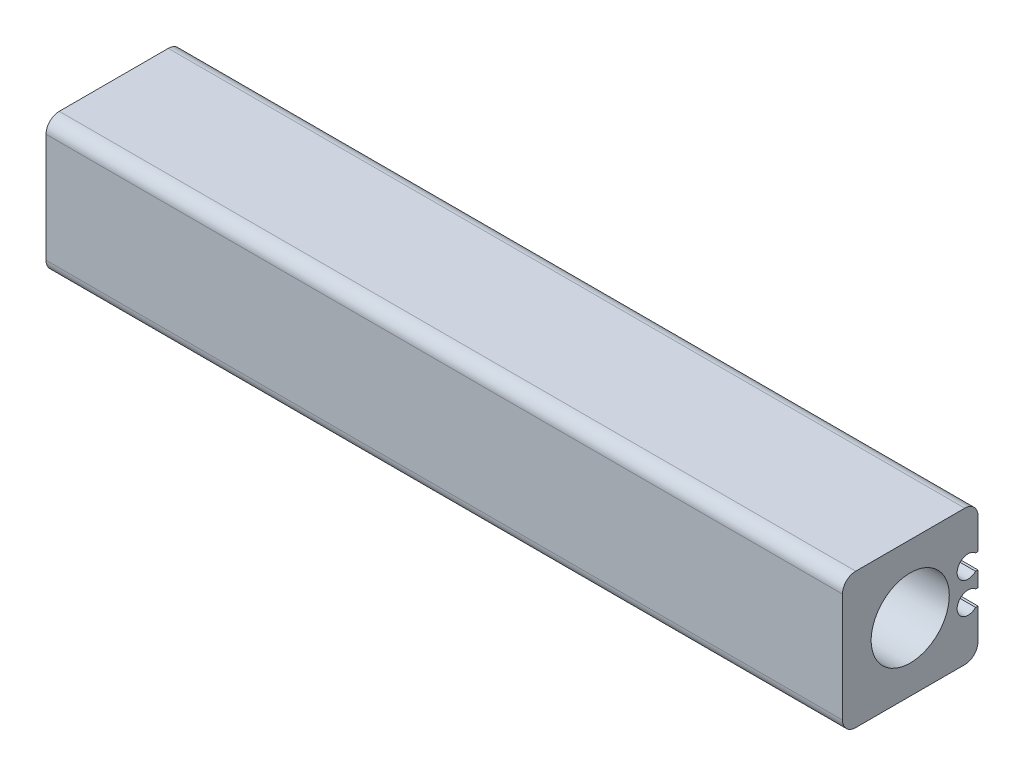
ISO-10303-21;
HEADER;
FILE_DESCRIPTION(('STEP AP214'),'2;1');
FILE_NAME('part.step','',(''),(''),'','','');
FILE_SCHEMA(('AUTOMOTIVE_DESIGN { 1 0 10303 214 1 1 1 1 }'));
ENDSEC;
DATA;
#1=APPLICATION_CONTEXT('core data for automotive mechanical design processes');
#2=APPLICATION_PROTOCOL_DEFINITION('international standard','automotive_design',2000,#1);
#3=PRODUCT_CONTEXT('',#1,'mechanical');
#4=PRODUCT('Part','Part','',(#3));
#5=PRODUCT_RELATED_PRODUCT_CATEGORY('part','',(#4));
#6=PRODUCT_DEFINITION_FORMATION('','',#4);
#7=PRODUCT_DEFINITION_CONTEXT('part definition',#1,'design');
#8=PRODUCT_DEFINITION('design','',#6,#7);
#9=PRODUCT_DEFINITION_SHAPE('','',#8);
#10=(LENGTH_UNIT() NAMED_UNIT(*) SI_UNIT(.MILLI.,.METRE.));
#11=(NAMED_UNIT(*) PLANE_ANGLE_UNIT() SI_UNIT($,.RADIAN.));
#12=(NAMED_UNIT(*) SI_UNIT($,.STERADIAN.) SOLID_ANGLE_UNIT());
#13=UNCERTAINTY_MEASURE_WITH_UNIT(LENGTH_MEASURE(1.E-05),#10,'distance_accuracy_value','');
#14=(GEOMETRIC_REPRESENTATION_CONTEXT(3) GLOBAL_UNCERTAINTY_ASSIGNED_CONTEXT((#13)) GLOBAL_UNIT_ASSIGNED_CONTEXT((#10,
#11,#12)) REPRESENTATION_CONTEXT('',''));
#15=CARTESIAN_POINT('',(0.,0.,0.));
#16=DIRECTION('',(0.,0.,1.));
#17=DIRECTION('',(1.,0.,0.));
#18=AXIS2_PLACEMENT_3D('',#15,#16,#17);
#19=CARTESIAN_POINT('',(76.393675,13.,-13.));
#20=DIRECTION('',(0.,0.,1.));
#21=DIRECTION('',(0.,-1.,0.));
#22=AXIS2_PLACEMENT_3D('',#19,#20,#21);
#23=PLANE('',#22);
#24=DIRECTION('',(0.,1.,0.));
#25=VECTOR('',#24,1.);
#26=CARTESIAN_POINT('',(-76.393675,13.,-13.));
#27=LINE('',#26,#25);
#28=CARTESIAN_POINT('',(-76.393675,-1.475,-13.));
#29=VERTEX_POINT('',#28);
#30=CARTESIAN_POINT('',(-76.393675,1.475,-13.));
#31=VERTEX_POINT('',#30);
#32=EDGE_CURVE('E308',#29,#31,#27,.T.);
#33=ORIENTED_EDGE('',*,*,#32,.T.);
#34=DIRECTION('',(-1.,0.,0.));
#35=VECTOR('',#34,1.);
#36=CARTESIAN_POINT('',(76.393675,1.475,-13.));
#37=LINE('',#36,#35);
#38=CARTESIAN_POINT('',(76.393675,1.475,-13.));
#39=VERTEX_POINT('',#38);
#40=EDGE_CURVE('E247',#39,#31,#37,.T.);
#41=ORIENTED_EDGE('',*,*,#40,.F.);
#42=DIRECTION('',(0.,1.,0.));
#43=VECTOR('',#42,1.);
#44=CARTESIAN_POINT('',(76.393675,13.,-13.));
#45=LINE('',#44,#43);
#46=CARTESIAN_POINT('',(76.393675,-1.475,-13.));
#47=VERTEX_POINT('',#46);
#48=EDGE_CURVE('E297',#47,#39,#45,.T.);
#49=ORIENTED_EDGE('',*,*,#48,.F.);
#50=DIRECTION('',(-1.,0.,0.));
#51=VECTOR('',#50,1.);
#52=CARTESIAN_POINT('',(76.393675,-1.475,-13.));
#53=LINE('',#52,#51);
#54=EDGE_CURVE('E276',#47,#29,#53,.T.);
#55=ORIENTED_EDGE('',*,*,#54,.T.);
#56=EDGE_LOOP('',(#33,#41,#49,#55));
#57=FACE_BOUND('',#56,.T.);
#58=ADVANCED_FACE('F16',(#57),#23,.F.);
#59=CARTESIAN_POINT('',(76.393675,-10.46,-13.));
#60=VERTEX_POINT('',#59);
#61=CARTESIAN_POINT('',(76.393675,-4.525,-13.));
#62=VERTEX_POINT('',#61);
#63=EDGE_CURVE('E294',#60,#62,#45,.T.);
#64=ORIENTED_EDGE('',*,*,#63,.F.);
#65=DIRECTION('',(-1.,0.,0.));
#66=VECTOR('',#65,1.);
#67=CARTESIAN_POINT('',(76.393675,-10.46,-13.));
#68=LINE('',#67,#66);
#69=CARTESIAN_POINT('',(-76.393675,-10.46,-13.));
#70=VERTEX_POINT('',#69);
#71=EDGE_CURVE('E334',#60,#70,#68,.T.);
#72=ORIENTED_EDGE('',*,*,#71,.T.);
#73=CARTESIAN_POINT('',(-76.393675,-4.525,-13.));
#74=VERTEX_POINT('',#73);
#75=EDGE_CURVE('E306',#70,#74,#27,.T.);
#76=ORIENTED_EDGE('',*,*,#75,.T.);
#77=DIRECTION('',(-1.,0.,0.));
#78=VECTOR('',#77,1.);
#79=CARTESIAN_POINT('',(76.393675,-4.525,-13.));
#80=LINE('',#79,#78);
#81=EDGE_CURVE('E273',#62,#74,#80,.T.);
#82=ORIENTED_EDGE('',*,*,#81,.F.);
#83=EDGE_LOOP('',(#64,#72,#76,#82));
#84=FACE_BOUND('',#83,.T.);
#85=ADVANCED_FACE('F372',(#84),#23,.F.);
#86=CARTESIAN_POINT('',(76.393675,13.,13.));
#87=DIRECTION('',(0.,0.,-1.));
#88=DIRECTION('',(0.,1.,0.));
#89=AXIS2_PLACEMENT_3D('',#86,#87,#88);
#90=PLANE('',#89);
#91=DIRECTION('',(0.,-1.,0.));
#92=VECTOR('',#91,1.);
#93=CARTESIAN_POINT('',(-76.393675,13.,13.));
#94=LINE('',#93,#92);
#95=CARTESIAN_POINT('',(-76.393675,10.46,13.));
#96=VERTEX_POINT('',#95);
#97=CARTESIAN_POINT('',(-76.393675,-10.46,13.));
#98=VERTEX_POINT('',#97);
#99=EDGE_CURVE('E284',#96,#98,#94,.T.);
#100=ORIENTED_EDGE('',*,*,#99,.T.);
#101=DIRECTION('',(-1.,0.,0.));
#102=VECTOR('',#101,1.);
#103=CARTESIAN_POINT('',(76.393675,-10.46,13.));
#104=LINE('',#103,#102);
#105=CARTESIAN_POINT('',(76.393675,-10.46,13.));
#106=VERTEX_POINT('',#105);
#107=EDGE_CURVE('E325',#98,#106,#104,.F.);
#108=ORIENTED_EDGE('',*,*,#107,.T.);
#109=DIRECTION('',(0.,-1.,0.));
#110=VECTOR('',#109,1.);
#111=CARTESIAN_POINT('',(76.393675,13.,13.));
#112=LINE('',#111,#110);
#113=CARTESIAN_POINT('',(76.393675,10.46,13.));
#114=VERTEX_POINT('',#113);
#115=EDGE_CURVE('E287',#114,#106,#112,.T.);
#116=ORIENTED_EDGE('',*,*,#115,.F.);
#117=DIRECTION('',(-1.,0.,0.));
#118=VECTOR('',#117,1.);
#119=CARTESIAN_POINT('',(76.393675,10.46,13.));
#120=LINE('',#119,#118);
#121=EDGE_CURVE('E322',#114,#96,#120,.T.);
#122=ORIENTED_EDGE('',*,*,#121,.T.);
#123=EDGE_LOOP('',(#100,#108,#116,#122));
#124=FACE_BOUND('',#123,.T.);
#125=ADVANCED_FACE('F354',(#124),#90,.F.);
#126=CARTESIAN_POINT('',(76.393675,-13.,13.));
#127=DIRECTION('',(0.,1.,0.));
#128=DIRECTION('',(0.,0.,1.));
#129=AXIS2_PLACEMENT_3D('',#126,#127,#128);
#130=PLANE('',#129);
#131=CARTESIAN_POINT('',(34.101725,-13.,-7.5));
#132=DIRECTION('',(0.,-1.,0.));
#133=DIRECTION('',(0.,0.,-1.));
#134=AXIS2_PLACEMENT_3D('',#131,#132,#133);
#135=CIRCLE('',#134,1.25);
#136=CARTESIAN_POINT('',(34.101725,-13.,-8.75));
#137=VERTEX_POINT('',#136);
#138=EDGE_CURVE('E164',#137,#137,#135,.T.);
#139=ORIENTED_EDGE('',*,*,#138,.F.);
#140=EDGE_LOOP('',(#139));
#141=FACE_BOUND('',#140,.T.);
#142=CARTESIAN_POINT('',(17.101725,-13.,-7.5));
#143=DIRECTION('',(0.,-1.,0.));
#144=DIRECTION('',(0.,0.,-1.));
#145=AXIS2_PLACEMENT_3D('',#142,#143,#144);
#146=CIRCLE('',#145,1.25);
#147=CARTESIAN_POINT('',(17.101725,-13.,-8.75));
#148=VERTEX_POINT('',#147);
#149=EDGE_CURVE('E176',#148,#148,#146,.T.);
#150=ORIENTED_EDGE('',*,*,#149,.F.);
#151=EDGE_LOOP('',(#150));
#152=FACE_BOUND('',#151,.T.);
#153=CARTESIAN_POINT('',(-60.393675,-13.,-7.5));
#154=DIRECTION('',(0.,-1.,0.));
#155=DIRECTION('',(0.,0.,-1.));
#156=AXIS2_PLACEMENT_3D('',#153,#154,#155);
#157=CIRCLE('',#156,1.25);
#158=CARTESIAN_POINT('',(-60.393675,-13.,-8.75));
#159=VERTEX_POINT('',#158);
#160=EDGE_CURVE('E188',#159,#159,#157,.T.);
#161=ORIENTED_EDGE('',*,*,#160,.F.);
#162=EDGE_LOOP('',(#161));
#163=FACE_BOUND('',#162,.T.);
#164=CARTESIAN_POINT('',(34.101725,-13.,8.5));
#165=DIRECTION('',(0.,-1.,0.));
#166=DIRECTION('',(0.,0.,-1.));
#167=AXIS2_PLACEMENT_3D('',#164,#165,#166);
#168=CIRCLE('',#167,1.25);
#169=CARTESIAN_POINT('',(34.101725,-13.,7.25));
#170=VERTEX_POINT('',#169);
#171=EDGE_CURVE('E200',#170,#170,#168,.T.);
#172=ORIENTED_EDGE('',*,*,#171,.F.);
#173=EDGE_LOOP('',(#172));
#174=FACE_BOUND('',#173,.T.);
#175=CARTESIAN_POINT('',(17.101725,-13.,8.5));
#176=DIRECTION('',(0.,-1.,0.));
#177=DIRECTION('',(0.,0.,-1.));
#178=AXIS2_PLACEMENT_3D('',#175,#176,#177);
#179=CIRCLE('',#178,1.25);
#180=CARTESIAN_POINT('',(17.101725,-13.,7.25));
#181=VERTEX_POINT('',#180);
#182=EDGE_CURVE('E212',#181,#181,#179,.T.);
#183=ORIENTED_EDGE('',*,*,#182,.F.);
#184=EDGE_LOOP('',(#183));
#185=FACE_BOUND('',#184,.T.);
#186=CARTESIAN_POINT('',(-60.393675,-13.,8.5));
#187=DIRECTION('',(0.,-1.,0.));
#188=DIRECTION('',(0.,0.,-1.));
#189=AXIS2_PLACEMENT_3D('',#186,#187,#188);
#190=CIRCLE('',#189,1.25);
#191=CARTESIAN_POINT('',(-60.393675,-13.,7.25));
#192=VERTEX_POINT('',#191);
#193=EDGE_CURVE('E224',#192,#192,#190,.T.);
#194=ORIENTED_EDGE('',*,*,#193,.F.);
#195=EDGE_LOOP('',(#194));
#196=FACE_BOUND('',#195,.T.);
#197=DIRECTION('',(0.,0.,-1.));
#198=VECTOR('',#197,1.);
#199=CARTESIAN_POINT('',(76.393675,-13.,13.));
#200=LINE('',#199,#198);
#201=CARTESIAN_POINT('',(76.393675,-13.,10.46));
#202=VERTEX_POINT('',#201);
#203=CARTESIAN_POINT('',(76.393675,-13.,-10.46));
#204=VERTEX_POINT('',#203);
#205=EDGE_CURVE('E290',#202,#204,#200,.T.);
#206=ORIENTED_EDGE('',*,*,#205,.F.);
#207=DIRECTION('',(-1.,0.,0.));
#208=VECTOR('',#207,1.);
#209=CARTESIAN_POINT('',(76.393675,-13.,10.46));
#210=LINE('',#209,#208);
#211=CARTESIAN_POINT('',(-76.393675,-13.,10.46));
#212=VERTEX_POINT('',#211);
#213=EDGE_CURVE('E311',#202,#212,#210,.T.);
#214=ORIENTED_EDGE('',*,*,#213,.T.);
#215=DIRECTION('',(0.,0.,-1.));
#216=VECTOR('',#215,1.);
#217=CARTESIAN_POINT('',(-76.393675,-13.,13.));
#218=LINE('',#217,#216);
#219=CARTESIAN_POINT('',(-76.393675,-13.,-10.46));
#220=VERTEX_POINT('',#219);
#221=EDGE_CURVE('E302',#212,#220,#218,.T.);
#222=ORIENTED_EDGE('',*,*,#221,.T.);
#223=DIRECTION('',(-1.,0.,0.));
#224=VECTOR('',#223,1.);
#225=CARTESIAN_POINT('',(76.393675,-13.,-10.46));
#226=LINE('',#225,#224);
#227=EDGE_CURVE('E299',#220,#204,#226,.F.);
#228=ORIENTED_EDGE('',*,*,#227,.T.);
#229=EDGE_LOOP('',(#206,#214,#222,#228));
#230=FACE_BOUND('',#229,.T.);
#231=ADVANCED_FACE('F364',(#141,#152,#163,#174,#185,#196,#230),#130,.F.);
#232=CARTESIAN_POINT('',(-76.393675,4.525,-13.));
#233=VERTEX_POINT('',#232);
#234=CARTESIAN_POINT('',(-76.393675,10.46,-13.));
#235=VERTEX_POINT('',#234);
#236=EDGE_CURVE('E305',#233,#235,#27,.T.);
#237=ORIENTED_EDGE('',*,*,#236,.T.);
#238=DIRECTION('',(-1.,0.,0.));
#239=VECTOR('',#238,1.);
#240=CARTESIAN_POINT('',(76.393675,10.46,-13.));
#241=LINE('',#240,#239);
#242=CARTESIAN_POINT('',(76.393675,10.46,-13.));
#243=VERTEX_POINT('',#242);
#244=EDGE_CURVE('E10',#235,#243,#241,.F.);
#245=ORIENTED_EDGE('',*,*,#244,.T.);
#246=CARTESIAN_POINT('',(76.393675,4.525,-13.));
#247=VERTEX_POINT('',#246);
#248=EDGE_CURVE('E293',#247,#243,#45,.T.);
#249=ORIENTED_EDGE('',*,*,#248,.F.);
#250=DIRECTION('',(-1.,0.,0.));
#251=VECTOR('',#250,1.);
#252=CARTESIAN_POINT('',(76.393675,4.525,-13.));
#253=LINE('',#252,#251);
#254=EDGE_CURVE('E249',#247,#233,#253,.T.);
#255=ORIENTED_EDGE('',*,*,#254,.T.);
#256=EDGE_LOOP('',(#237,#245,#249,#255));
#257=FACE_BOUND('',#256,.T.);
#258=ADVANCED_FACE('F395',(#257),#23,.F.);
#259=CARTESIAN_POINT('',(76.393675,13.,13.));
#260=DIRECTION('',(0.,-1.,0.));
#261=DIRECTION('',(0.,0.,-1.));
#262=AXIS2_PLACEMENT_3D('',#259,#260,#261);
#263=PLANE('',#262);
#264=DIRECTION('',(0.,0.,1.));
#265=VECTOR('',#264,1.);
#266=CARTESIAN_POINT('',(76.393675,13.,13.));
#267=LINE('',#266,#265);
#268=CARTESIAN_POINT('',(76.393675,13.,-10.46));
#269=VERTEX_POINT('',#268);
#270=CARTESIAN_POINT('',(76.393675,13.,10.46));
#271=VERTEX_POINT('',#270);
#272=EDGE_CURVE('E296',#269,#271,#267,.T.);
#273=ORIENTED_EDGE('',*,*,#272,.F.);
#274=DIRECTION('',(-1.,0.,0.));
#275=VECTOR('',#274,1.);
#276=CARTESIAN_POINT('',(76.393675,13.,-10.46));
#277=LINE('',#276,#275);
#278=CARTESIAN_POINT('',(-76.393675,13.,-10.46));
#279=VERTEX_POINT('',#278);
#280=EDGE_CURVE('E24',#269,#279,#277,.T.);
#281=ORIENTED_EDGE('',*,*,#280,.T.);
#282=DIRECTION('',(0.,0.,1.));
#283=VECTOR('',#282,1.);
#284=CARTESIAN_POINT('',(-76.393675,13.,13.));
#285=LINE('',#284,#283);
#286=CARTESIAN_POINT('',(-76.393675,13.,10.46));
#287=VERTEX_POINT('',#286);
#288=EDGE_CURVE('E291',#279,#287,#285,.T.);
#289=ORIENTED_EDGE('',*,*,#288,.T.);
#290=DIRECTION('',(-1.,0.,0.));
#291=VECTOR('',#290,1.);
#292=CARTESIAN_POINT('',(76.393675,13.,10.46));
#293=LINE('',#292,#291);
#294=EDGE_CURVE('E39',#287,#271,#293,.F.);
#295=ORIENTED_EDGE('',*,*,#294,.T.);
#296=EDGE_LOOP('',(#273,#281,#289,#295));
#297=FACE_BOUND('',#296,.T.);
#298=ADVANCED_FACE('F340',(#297),#263,.F.);
#299=CARTESIAN_POINT('',(76.393675,-13.,13.));
#300=DIRECTION('',(1.,0.,0.));
#301=DIRECTION('',(0.,0.,-1.));
#302=AXIS2_PLACEMENT_3D('',#299,#300,#301);
#303=PLANE('',#302);
#304=ORIENTED_EDGE('',*,*,#115,.T.);
#305=CARTESIAN_POINT('',(76.393675,-10.46,10.46));
#306=DIRECTION('',(1.,0.,0.));
#307=DIRECTION('',(0.,0.,-1.));
#308=AXIS2_PLACEMENT_3D('',#305,#306,#307);
#309=CIRCLE('',#308,2.54);
#310=EDGE_CURVE('E332',#106,#202,#309,.T.);
#311=ORIENTED_EDGE('',*,*,#310,.T.);
#312=ORIENTED_EDGE('',*,*,#205,.T.);
#313=CARTESIAN_POINT('',(76.393675,-10.46,-10.46));
#314=DIRECTION('',(1.,0.,0.));
#315=DIRECTION('',(0.,0.,-1.));
#316=AXIS2_PLACEMENT_3D('',#313,#314,#315);
#317=CIRCLE('',#316,2.54);
#318=EDGE_CURVE('E31',#204,#60,#317,.T.);
#319=ORIENTED_EDGE('',*,*,#318,.T.);
#320=ORIENTED_EDGE('',*,*,#63,.T.);
#321=DIRECTION('',(0.,0.,1.));
#322=VECTOR('',#321,1.);
#323=CARTESIAN_POINT('',(76.393675,-4.525,-13.));
#324=LINE('',#323,#322);
#325=CARTESIAN_POINT('',(76.393675,-4.525,-12.5437364717981));
#326=VERTEX_POINT('',#325);
#327=EDGE_CURVE('E261',#62,#326,#324,.T.);
#328=ORIENTED_EDGE('',*,*,#327,.T.);
#329=CARTESIAN_POINT('',(76.393675,-3.,-11.1));
#330=DIRECTION('',(-1.,0.,0.));
#331=DIRECTION('',(0.,0.,1.));
#332=AXIS2_PLACEMENT_3D('',#329,#330,#331);
#333=CIRCLE('',#332,2.1);
#334=CARTESIAN_POINT('',(76.393675,-1.475,-12.5437364717981));
#335=VERTEX_POINT('',#334);
#336=EDGE_CURVE('E254',#326,#335,#333,.T.);
#337=ORIENTED_EDGE('',*,*,#336,.T.);
#338=DIRECTION('',(0.,0.,-1.));
#339=VECTOR('',#338,1.);
#340=CARTESIAN_POINT('',(76.393675,-1.475,-13.));
#341=LINE('',#340,#339);
#342=EDGE_CURVE('E257',#335,#47,#341,.T.);
#343=ORIENTED_EDGE('',*,*,#342,.T.);
#344=ORIENTED_EDGE('',*,*,#48,.T.);
#345=DIRECTION('',(0.,0.,1.));
#346=VECTOR('',#345,1.);
#347=CARTESIAN_POINT('',(76.393675,1.475,-13.));
#348=LINE('',#347,#346);
#349=CARTESIAN_POINT('',(76.393675,1.475,-12.5437364717981));
#350=VERTEX_POINT('',#349);
#351=EDGE_CURVE('E235',#39,#350,#348,.T.);
#352=ORIENTED_EDGE('',*,*,#351,.T.);
#353=CARTESIAN_POINT('',(76.393675,3.,-11.1));
#354=DIRECTION('',(-1.,0.,0.));
#355=DIRECTION('',(0.,0.,1.));
#356=AXIS2_PLACEMENT_3D('',#353,#354,#355);
#357=CIRCLE('',#356,2.1);
#358=CARTESIAN_POINT('',(76.393675,4.525,-12.5437364717981));
#359=VERTEX_POINT('',#358);
#360=EDGE_CURVE('E228',#350,#359,#357,.T.);
#361=ORIENTED_EDGE('',*,*,#360,.T.);
#362=DIRECTION('',(0.,0.,-1.));
#363=VECTOR('',#362,1.);
#364=CARTESIAN_POINT('',(76.393675,4.525,-13.));
#365=LINE('',#364,#363);
#366=EDGE_CURVE('E231',#359,#247,#365,.T.);
#367=ORIENTED_EDGE('',*,*,#366,.T.);
#368=ORIENTED_EDGE('',*,*,#248,.T.);
#369=CARTESIAN_POINT('',(76.393675,10.46,-10.46));
#370=DIRECTION('',(1.,0.,0.));
#371=DIRECTION('',(0.,0.,-1.));
#372=AXIS2_PLACEMENT_3D('',#369,#370,#371);
#373=CIRCLE('',#372,2.54);
#374=EDGE_CURVE('E329',#243,#269,#373,.T.);
#375=ORIENTED_EDGE('',*,*,#374,.T.);
#376=ORIENTED_EDGE('',*,*,#272,.T.);
#377=CARTESIAN_POINT('',(76.393675,10.46,10.46));
#378=DIRECTION('',(1.,0.,0.));
#379=DIRECTION('',(0.,0.,-1.));
#380=AXIS2_PLACEMENT_3D('',#377,#378,#379);
#381=CIRCLE('',#380,2.54);
#382=EDGE_CURVE('E327',#271,#114,#381,.T.);
#383=ORIENTED_EDGE('',*,*,#382,.T.);
#384=EDGE_LOOP('',(#304,#311,#312,#319,#320,#328,#337,#343,#344,#352,#361,#367,#368,#375,#376,#383));
#385=FACE_BOUND('',#384,.T.);
#386=CARTESIAN_POINT('',(76.393675,0.,0.));
#387=DIRECTION('',(1.,0.,0.));
#388=DIRECTION('',(0.,0.,-1.));
#389=AXIS2_PLACEMENT_3D('',#386,#387,#388);
#390=CIRCLE('',#389,7.493);
#391=CARTESIAN_POINT('',(76.393675,0.,-7.493));
#392=VERTEX_POINT('',#391);
#393=EDGE_CURVE('E272',#392,#392,#390,.T.);
#394=ORIENTED_EDGE('',*,*,#393,.F.);
#395=EDGE_LOOP('',(#394));
#396=FACE_BOUND('',#395,.T.);
#397=ADVANCED_FACE('F357',(#385,#396),#303,.T.);
#398=CARTESIAN_POINT('',(-76.393675,-13.,13.));
#399=DIRECTION('',(1.,0.,0.));
#400=DIRECTION('',(0.,0.,-1.));
#401=AXIS2_PLACEMENT_3D('',#398,#399,#400);
#402=PLANE('',#401);
#403=CARTESIAN_POINT('',(-76.393675,0.,0.));
#404=DIRECTION('',(1.,0.,0.));
#405=DIRECTION('',(0.,0.,-1.));
#406=AXIS2_PLACEMENT_3D('',#403,#404,#405);
#407=CIRCLE('',#406,7.493);
#408=CARTESIAN_POINT('',(-76.393675,0.,-7.493));
#409=VERTEX_POINT('',#408);
#410=EDGE_CURVE('E281',#409,#409,#407,.T.);
#411=ORIENTED_EDGE('',*,*,#410,.T.);
#412=EDGE_LOOP('',(#411));
#413=FACE_BOUND('',#412,.T.);
#414=ORIENTED_EDGE('',*,*,#221,.F.);
#415=CARTESIAN_POINT('',(-76.393675,-10.46,10.46));
#416=DIRECTION('',(1.,0.,0.));
#417=DIRECTION('',(0.,0.,-1.));
#418=AXIS2_PLACEMENT_3D('',#415,#416,#417);
#419=CIRCLE('',#418,2.54);
#420=EDGE_CURVE('E320',#212,#98,#419,.F.);
#421=ORIENTED_EDGE('',*,*,#420,.T.);
#422=ORIENTED_EDGE('',*,*,#99,.F.);
#423=CARTESIAN_POINT('',(-76.393675,10.46,10.46));
#424=DIRECTION('',(1.,0.,0.));
#425=DIRECTION('',(0.,0.,-1.));
#426=AXIS2_PLACEMENT_3D('',#423,#424,#425);
#427=CIRCLE('',#426,2.54);
#428=EDGE_CURVE('E314',#96,#287,#427,.F.);
#429=ORIENTED_EDGE('',*,*,#428,.T.);
#430=ORIENTED_EDGE('',*,*,#288,.F.);
#431=CARTESIAN_POINT('',(-76.393675,10.46,-10.46));
#432=DIRECTION('',(1.,0.,0.));
#433=DIRECTION('',(0.,0.,-1.));
#434=AXIS2_PLACEMENT_3D('',#431,#432,#433);
#435=CIRCLE('',#434,2.54);
#436=EDGE_CURVE('E316',#279,#235,#435,.F.);
#437=ORIENTED_EDGE('',*,*,#436,.T.);
#438=ORIENTED_EDGE('',*,*,#236,.F.);
#439=DIRECTION('',(0.,0.,-1.));
#440=VECTOR('',#439,1.);
#441=CARTESIAN_POINT('',(-76.393675,4.525,-13.));
#442=LINE('',#441,#440);
#443=CARTESIAN_POINT('',(-76.393675,4.525,-12.5437364717981));
#444=VERTEX_POINT('',#443);
#445=EDGE_CURVE('E240',#444,#233,#442,.T.);
#446=ORIENTED_EDGE('',*,*,#445,.F.);
#447=CARTESIAN_POINT('',(-76.393675,3.,-11.1));
#448=DIRECTION('',(-1.,0.,0.));
#449=DIRECTION('',(0.,0.,1.));
#450=AXIS2_PLACEMENT_3D('',#447,#448,#449);
#451=CIRCLE('',#450,2.1);
#452=CARTESIAN_POINT('',(-76.393675,1.475,-12.5437364717981));
#453=VERTEX_POINT('',#452);
#454=EDGE_CURVE('E227',#453,#444,#451,.T.);
#455=ORIENTED_EDGE('',*,*,#454,.F.);
#456=DIRECTION('',(0.,0.,1.));
#457=VECTOR('',#456,1.);
#458=CARTESIAN_POINT('',(-76.393675,1.475,-13.));
#459=LINE('',#458,#457);
#460=EDGE_CURVE('E232',#31,#453,#459,.T.);
#461=ORIENTED_EDGE('',*,*,#460,.F.);
#462=ORIENTED_EDGE('',*,*,#32,.F.);
#463=DIRECTION('',(0.,0.,-1.));
#464=VECTOR('',#463,1.);
#465=CARTESIAN_POINT('',(-76.393675,-1.475,-13.));
#466=LINE('',#465,#464);
#467=CARTESIAN_POINT('',(-76.393675,-1.475,-12.5437364717981));
#468=VERTEX_POINT('',#467);
#469=EDGE_CURVE('E266',#468,#29,#466,.T.);
#470=ORIENTED_EDGE('',*,*,#469,.F.);
#471=CARTESIAN_POINT('',(-76.393675,-3.,-11.1));
#472=DIRECTION('',(-1.,0.,0.));
#473=DIRECTION('',(0.,0.,1.));
#474=AXIS2_PLACEMENT_3D('',#471,#472,#473);
#475=CIRCLE('',#474,2.1);
#476=CARTESIAN_POINT('',(-76.393675,-4.525,-12.5437364717981));
#477=VERTEX_POINT('',#476);
#478=EDGE_CURVE('E246',#477,#468,#475,.T.);
#479=ORIENTED_EDGE('',*,*,#478,.F.);
#480=DIRECTION('',(0.,0.,1.));
#481=VECTOR('',#480,1.);
#482=CARTESIAN_POINT('',(-76.393675,-4.525,-13.));
#483=LINE('',#482,#481);
#484=EDGE_CURVE('E258',#74,#477,#483,.T.);
#485=ORIENTED_EDGE('',*,*,#484,.F.);
#486=ORIENTED_EDGE('',*,*,#75,.F.);
#487=CARTESIAN_POINT('',(-76.393675,-10.46,-10.46));
#488=DIRECTION('',(1.,0.,0.));
#489=DIRECTION('',(0.,0.,-1.));
#490=AXIS2_PLACEMENT_3D('',#487,#488,#489);
#491=CIRCLE('',#490,2.54);
#492=EDGE_CURVE('E318',#70,#220,#491,.F.);
#493=ORIENTED_EDGE('',*,*,#492,.T.);
#494=EDGE_LOOP('',(#414,#421,#422,#429,#430,#437,#438,#446,#455,#461,#462,#470,#479,#485,#486,#493));
#495=FACE_BOUND('',#494,.T.);
#496=ADVANCED_FACE('F345',(#413,#495),#402,.F.);
#497=CARTESIAN_POINT('',(-76.393675,0.,0.));
#498=DIRECTION('',(1.,0.,0.));
#499=DIRECTION('',(0.,0.,-1.));
#500=AXIS2_PLACEMENT_3D('',#497,#498,#499);
#501=CYLINDRICAL_SURFACE('',#500,7.493);
#502=ORIENTED_EDGE('',*,*,#410,.F.);
#503=EDGE_LOOP('',(#502));
#504=FACE_BOUND('',#503,.T.);
#505=ORIENTED_EDGE('',*,*,#393,.T.);
#506=EDGE_LOOP('',(#505));
#507=FACE_BOUND('',#506,.T.);
#508=ADVANCED_FACE('F753',(#504,#507),#501,.F.);
#509=CARTESIAN_POINT('',(76.393675,-3.,-11.1));
#510=DIRECTION('',(-1.,0.,0.));
#511=DIRECTION('',(0.,0.,1.));
#512=AXIS2_PLACEMENT_3D('',#509,#510,#511);
#513=CYLINDRICAL_SURFACE('',#512,2.1);
#514=ORIENTED_EDGE('',*,*,#478,.T.);
#515=DIRECTION('',(-1.,0.,0.));
#516=VECTOR('',#515,1.);
#517=CARTESIAN_POINT('',(76.393675,-1.475,-12.5437364717981));
#518=LINE('',#517,#516);
#519=EDGE_CURVE('E264',#335,#468,#518,.T.);
#520=ORIENTED_EDGE('',*,*,#519,.F.);
#521=ORIENTED_EDGE('',*,*,#336,.F.);
#522=DIRECTION('',(-1.,0.,0.));
#523=VECTOR('',#522,1.);
#524=CARTESIAN_POINT('',(76.393675,-4.525,-12.5437364717981));
#525=LINE('',#524,#523);
#526=EDGE_CURVE('E270',#326,#477,#525,.T.);
#527=ORIENTED_EDGE('',*,*,#526,.T.);
#528=EDGE_LOOP('',(#514,#520,#521,#527));
#529=FACE_BOUND('',#528,.T.);
#530=ADVANCED_FACE('F380',(#529),#513,.F.);
#531=CARTESIAN_POINT('',(76.393675,-4.525,-13.));
#532=DIRECTION('',(0.,-1.,0.));
#533=DIRECTION('',(0.,0.,-1.));
#534=AXIS2_PLACEMENT_3D('',#531,#532,#533);
#535=PLANE('',#534);
#536=ORIENTED_EDGE('',*,*,#484,.T.);
#537=ORIENTED_EDGE('',*,*,#526,.F.);
#538=ORIENTED_EDGE('',*,*,#327,.F.);
#539=ORIENTED_EDGE('',*,*,#81,.T.);
#540=EDGE_LOOP('',(#536,#537,#538,#539));
#541=FACE_BOUND('',#540,.T.);
#542=ADVANCED_FACE('F376',(#541),#535,.F.);
#543=CARTESIAN_POINT('',(76.393675,-1.475,-13.));
#544=DIRECTION('',(0.,1.,0.));
#545=DIRECTION('',(0.,0.,1.));
#546=AXIS2_PLACEMENT_3D('',#543,#544,#545);
#547=PLANE('',#546);
#548=ORIENTED_EDGE('',*,*,#469,.T.);
#549=ORIENTED_EDGE('',*,*,#54,.F.);
#550=ORIENTED_EDGE('',*,*,#342,.F.);
#551=ORIENTED_EDGE('',*,*,#519,.T.);
#552=EDGE_LOOP('',(#548,#549,#550,#551));
#553=FACE_BOUND('',#552,.T.);
#554=ADVANCED_FACE('F732',(#553),#547,.F.);
#555=CARTESIAN_POINT('',(76.393675,3.,-11.1));
#556=DIRECTION('',(-1.,0.,0.));
#557=DIRECTION('',(0.,0.,1.));
#558=AXIS2_PLACEMENT_3D('',#555,#556,#557);
#559=CYLINDRICAL_SURFACE('',#558,2.1);
#560=ORIENTED_EDGE('',*,*,#454,.T.);
#561=DIRECTION('',(-1.,0.,0.));
#562=VECTOR('',#561,1.);
#563=CARTESIAN_POINT('',(76.393675,4.525,-12.5437364717981));
#564=LINE('',#563,#562);
#565=EDGE_CURVE('E238',#359,#444,#564,.T.);
#566=ORIENTED_EDGE('',*,*,#565,.F.);
#567=ORIENTED_EDGE('',*,*,#360,.F.);
#568=DIRECTION('',(-1.,0.,0.));
#569=VECTOR('',#568,1.);
#570=CARTESIAN_POINT('',(76.393675,1.475,-12.5437364717981));
#571=LINE('',#570,#569);
#572=EDGE_CURVE('E244',#350,#453,#571,.T.);
#573=ORIENTED_EDGE('',*,*,#572,.T.);
#574=EDGE_LOOP('',(#560,#566,#567,#573));
#575=FACE_BOUND('',#574,.T.);
#576=ADVANCED_FACE('F404',(#575),#559,.F.);
#577=CARTESIAN_POINT('',(76.393675,1.475,-13.));
#578=DIRECTION('',(0.,-1.,0.));
#579=DIRECTION('',(0.,0.,-1.));
#580=AXIS2_PLACEMENT_3D('',#577,#578,#579);
#581=PLANE('',#580);
#582=ORIENTED_EDGE('',*,*,#460,.T.);
#583=ORIENTED_EDGE('',*,*,#572,.F.);
#584=ORIENTED_EDGE('',*,*,#351,.F.);
#585=ORIENTED_EDGE('',*,*,#40,.T.);
#586=EDGE_LOOP('',(#582,#583,#584,#585));
#587=FACE_BOUND('',#586,.T.);
#588=ADVANCED_FACE('F401',(#587),#581,.F.);
#589=CARTESIAN_POINT('',(76.393675,4.525,-13.));
#590=DIRECTION('',(0.,1.,0.));
#591=DIRECTION('',(0.,0.,1.));
#592=AXIS2_PLACEMENT_3D('',#589,#590,#591);
#593=PLANE('',#592);
#594=ORIENTED_EDGE('',*,*,#445,.T.);
#595=ORIENTED_EDGE('',*,*,#254,.F.);
#596=ORIENTED_EDGE('',*,*,#366,.F.);
#597=ORIENTED_EDGE('',*,*,#565,.T.);
#598=EDGE_LOOP('',(#594,#595,#596,#597));
#599=FACE_BOUND('',#598,.T.);
#600=ADVANCED_FACE('F406',(#599),#593,.F.);
#601=CARTESIAN_POINT('',(76.393675,-10.46,10.46));
#602=DIRECTION('',(-1.,0.,0.));
#603=DIRECTION('',(0.,0.,1.));
#604=AXIS2_PLACEMENT_3D('',#601,#602,#603);
#605=CYLINDRICAL_SURFACE('',#604,2.54);
#606=ORIENTED_EDGE('',*,*,#310,.F.);
#607=ORIENTED_EDGE('',*,*,#107,.F.);
#608=ORIENTED_EDGE('',*,*,#420,.F.);
#609=ORIENTED_EDGE('',*,*,#213,.F.);
#610=EDGE_LOOP('',(#606,#607,#608,#609));
#611=FACE_BOUND('',#610,.T.);
#612=ADVANCED_FACE('F362',(#611),#605,.T.);
#613=CARTESIAN_POINT('',(76.393675,-10.46,-10.46));
#614=DIRECTION('',(-1.,0.,0.));
#615=DIRECTION('',(0.,0.,1.));
#616=AXIS2_PLACEMENT_3D('',#613,#614,#615);
#617=CYLINDRICAL_SURFACE('',#616,2.54);
#618=ORIENTED_EDGE('',*,*,#318,.F.);
#619=ORIENTED_EDGE('',*,*,#227,.F.);
#620=ORIENTED_EDGE('',*,*,#492,.F.);
#621=ORIENTED_EDGE('',*,*,#71,.F.);
#622=EDGE_LOOP('',(#618,#619,#620,#621));
#623=FACE_BOUND('',#622,.T.);
#624=ADVANCED_FACE('F370',(#623),#617,.T.);
#625=CARTESIAN_POINT('',(76.393675,10.46,-10.46));
#626=DIRECTION('',(-1.,0.,0.));
#627=DIRECTION('',(0.,0.,1.));
#628=AXIS2_PLACEMENT_3D('',#625,#626,#627);
#629=CYLINDRICAL_SURFACE('',#628,2.54);
#630=ORIENTED_EDGE('',*,*,#374,.F.);
#631=ORIENTED_EDGE('',*,*,#244,.F.);
#632=ORIENTED_EDGE('',*,*,#436,.F.);
#633=ORIENTED_EDGE('',*,*,#280,.F.);
#634=EDGE_LOOP('',(#630,#631,#632,#633));
#635=FACE_BOUND('',#634,.T.);
#636=ADVANCED_FACE('F394',(#635),#629,.T.);
#637=CARTESIAN_POINT('',(76.393675,10.46,10.46));
#638=DIRECTION('',(-1.,0.,0.));
#639=DIRECTION('',(0.,0.,1.));
#640=AXIS2_PLACEMENT_3D('',#637,#638,#639);
#641=CYLINDRICAL_SURFACE('',#640,2.54);
#642=ORIENTED_EDGE('',*,*,#382,.F.);
#643=ORIENTED_EDGE('',*,*,#294,.F.);
#644=ORIENTED_EDGE('',*,*,#428,.F.);
#645=ORIENTED_EDGE('',*,*,#121,.F.);
#646=EDGE_LOOP('',(#642,#643,#644,#645));
#647=FACE_BOUND('',#646,.T.);
#648=ADVANCED_FACE('F18',(#647),#641,.T.);
#649=CARTESIAN_POINT('',(-60.393675,-13.,8.5));
#650=DIRECTION('',(0.,-1.,0.));
#651=DIRECTION('',(0.,0.,-1.));
#652=AXIS2_PLACEMENT_3D('',#649,#650,#651);
#653=CYLINDRICAL_SURFACE('',#652,1.25);
#654=CARTESIAN_POINT('',(-60.393675,-7.99619999999999,8.5));
#655=DIRECTION('',(0.,-1.,0.));
#656=DIRECTION('',(0.,0.,-1.));
#657=AXIS2_PLACEMENT_3D('',#654,#655,#656);
#658=CIRCLE('',#657,1.25);
#659=CARTESIAN_POINT('',(-60.393675,-7.99619999999999,7.25));
#660=VERTEX_POINT('',#659);
#661=EDGE_CURVE('E221',#660,#660,#658,.T.);
#662=ORIENTED_EDGE('',*,*,#661,.F.);
#663=EDGE_LOOP('',(#662));
#664=FACE_BOUND('',#663,.T.);
#665=ORIENTED_EDGE('',*,*,#193,.T.);
#666=EDGE_LOOP('',(#665));
#667=FACE_BOUND('',#666,.T.);
#668=ADVANCED_FACE('F442',(#664,#667),#653,.F.);
#669=CARTESIAN_POINT('',(-59.368675,-7.99619999999999,8.5));
#670=DIRECTION('',(0.,1.,0.));
#671=DIRECTION('',(0.,0.,1.));
#672=AXIS2_PLACEMENT_3D('',#669,#670,#671);
#673=PLANE('',#672);
#674=CARTESIAN_POINT('',(-60.393675,-7.99619999999999,8.5));
#675=DIRECTION('',(0.,-1.,0.));
#676=DIRECTION('',(0.,0.,-1.));
#677=AXIS2_PLACEMENT_3D('',#674,#675,#676);
#678=CIRCLE('',#677,1.025);
#679=CARTESIAN_POINT('',(-60.393675,-7.99619999999999,7.475));
#680=VERTEX_POINT('',#679);
#681=EDGE_CURVE('E218',#680,#680,#678,.T.);
#682=ORIENTED_EDGE('',*,*,#681,.F.);
#683=EDGE_LOOP('',(#682));
#684=FACE_BOUND('',#683,.T.);
#685=ORIENTED_EDGE('',*,*,#661,.T.);
#686=EDGE_LOOP('',(#685));
#687=FACE_BOUND('',#686,.T.);
#688=ADVANCED_FACE('F446',(#684,#687),#673,.F.);
#689=CARTESIAN_POINT('',(-60.393675,-13.,8.5));
#690=DIRECTION('',(0.,-1.,0.));
#691=DIRECTION('',(0.,0.,-1.));
#692=AXIS2_PLACEMENT_3D('',#689,#690,#691);
#693=CYLINDRICAL_SURFACE('',#692,1.025);
#694=CARTESIAN_POINT('',(-60.393675,-5.7356,8.5));
#695=DIRECTION('',(0.,-1.,0.));
#696=DIRECTION('',(0.,0.,-1.));
#697=AXIS2_PLACEMENT_3D('',#694,#695,#696);
#698=CIRCLE('',#697,1.025);
#699=CARTESIAN_POINT('',(-60.393675,-5.7356,7.475));
#700=VERTEX_POINT('',#699);
#701=EDGE_CURVE('E215',#700,#700,#698,.T.);
#702=ORIENTED_EDGE('',*,*,#701,.F.);
#703=EDGE_LOOP('',(#702));
#704=FACE_BOUND('',#703,.T.);
#705=ORIENTED_EDGE('',*,*,#681,.T.);
#706=EDGE_LOOP('',(#705));
#707=FACE_BOUND('',#706,.T.);
#708=ADVANCED_FACE('F452',(#704,#707),#693,.F.);
#709=CARTESIAN_POINT('',(-60.393675,-5.7356,8.5));
#710=DIRECTION('',(0.,-1.,0.));
#711=DIRECTION('',(0.,0.,-1.));
#712=AXIS2_PLACEMENT_3D('',#709,#710,#711);
#713=CONICAL_SURFACE('',#712,1.025,1.02974425867665);
#714=CARTESIAN_POINT('',(-60.393675,-5.11971786549675,8.5));
#715=VERTEX_POINT('',#714);
#716=VERTEX_LOOP('',#715);
#717=FACE_BOUND('',#716,.T.);
#718=ORIENTED_EDGE('',*,*,#701,.T.);
#719=EDGE_LOOP('',(#718));
#720=FACE_BOUND('',#719,.T.);
#721=ADVANCED_FACE('F460',(#717,#720),#713,.F.);
#722=CARTESIAN_POINT('',(17.101725,-13.,8.5));
#723=DIRECTION('',(0.,-1.,0.));
#724=DIRECTION('',(0.,0.,-1.));
#725=AXIS2_PLACEMENT_3D('',#722,#723,#724);
#726=CYLINDRICAL_SURFACE('',#725,1.25);
#727=CARTESIAN_POINT('',(17.101725,-7.99619999999999,8.5));
#728=DIRECTION('',(0.,-1.,0.));
#729=DIRECTION('',(0.,0.,-1.));
#730=AXIS2_PLACEMENT_3D('',#727,#728,#729);
#731=CIRCLE('',#730,1.25);
#732=CARTESIAN_POINT('',(17.101725,-7.99619999999999,7.25));
#733=VERTEX_POINT('',#732);
#734=EDGE_CURVE('E209',#733,#733,#731,.T.);
#735=ORIENTED_EDGE('',*,*,#734,.F.);
#736=EDGE_LOOP('',(#735));
#737=FACE_BOUND('',#736,.T.);
#738=ORIENTED_EDGE('',*,*,#182,.T.);
#739=EDGE_LOOP('',(#738));
#740=FACE_BOUND('',#739,.T.);
#741=ADVANCED_FACE('F464',(#737,#740),#726,.F.);
#742=CARTESIAN_POINT('',(18.126725,-7.99619999999999,8.5));
#743=DIRECTION('',(0.,1.,0.));
#744=DIRECTION('',(0.,0.,1.));
#745=AXIS2_PLACEMENT_3D('',#742,#743,#744);
#746=PLANE('',#745);
#747=CARTESIAN_POINT('',(17.101725,-7.99619999999999,8.5));
#748=DIRECTION('',(0.,-1.,0.));
#749=DIRECTION('',(0.,0.,-1.));
#750=AXIS2_PLACEMENT_3D('',#747,#748,#749);
#751=CIRCLE('',#750,1.025);
#752=CARTESIAN_POINT('',(17.101725,-7.99619999999999,7.475));
#753=VERTEX_POINT('',#752);
#754=EDGE_CURVE('E206',#753,#753,#751,.T.);
#755=ORIENTED_EDGE('',*,*,#754,.F.);
#756=EDGE_LOOP('',(#755));
#757=FACE_BOUND('',#756,.T.);
#758=ORIENTED_EDGE('',*,*,#734,.T.);
#759=EDGE_LOOP('',(#758));
#760=FACE_BOUND('',#759,.T.);
#761=ADVANCED_FACE('F468',(#757,#760),#746,.F.);
#762=CARTESIAN_POINT('',(17.101725,-13.,8.5));
#763=DIRECTION('',(0.,-1.,0.));
#764=DIRECTION('',(0.,0.,-1.));
#765=AXIS2_PLACEMENT_3D('',#762,#763,#764);
#766=CYLINDRICAL_SURFACE('',#765,1.025);
#767=CARTESIAN_POINT('',(17.101725,-5.7356,8.5));
#768=DIRECTION('',(0.,-1.,0.));
#769=DIRECTION('',(0.,0.,-1.));
#770=AXIS2_PLACEMENT_3D('',#767,#768,#769);
#771=CIRCLE('',#770,1.025);
#772=CARTESIAN_POINT('',(17.101725,-5.7356,7.475));
#773=VERTEX_POINT('',#772);
#774=EDGE_CURVE('E203',#773,#773,#771,.T.);
#775=ORIENTED_EDGE('',*,*,#774,.F.);
#776=EDGE_LOOP('',(#775));
#777=FACE_BOUND('',#776,.T.);
#778=ORIENTED_EDGE('',*,*,#754,.T.);
#779=EDGE_LOOP('',(#778));
#780=FACE_BOUND('',#779,.T.);
#781=ADVANCED_FACE('F472',(#777,#780),#766,.F.);
#782=CARTESIAN_POINT('',(17.101725,-5.7356,8.5));
#783=DIRECTION('',(0.,-1.,0.));
#784=DIRECTION('',(0.,0.,-1.));
#785=AXIS2_PLACEMENT_3D('',#782,#783,#784);
#786=CONICAL_SURFACE('',#785,1.025,1.02974425867665);
#787=CARTESIAN_POINT('',(17.101725,-5.11971786549675,8.5));
#788=VERTEX_POINT('',#787);
#789=VERTEX_LOOP('',#788);
#790=FACE_BOUND('',#789,.T.);
#791=ORIENTED_EDGE('',*,*,#774,.T.);
#792=EDGE_LOOP('',(#791));
#793=FACE_BOUND('',#792,.T.);
#794=ADVANCED_FACE('F476',(#790,#793),#786,.F.);
#795=CARTESIAN_POINT('',(34.101725,-13.,8.5));
#796=DIRECTION('',(0.,-1.,0.));
#797=DIRECTION('',(0.,0.,-1.));
#798=AXIS2_PLACEMENT_3D('',#795,#796,#797);
#799=CYLINDRICAL_SURFACE('',#798,1.25);
#800=CARTESIAN_POINT('',(34.101725,-7.99619999999999,8.5));
#801=DIRECTION('',(0.,-1.,0.));
#802=DIRECTION('',(0.,0.,-1.));
#803=AXIS2_PLACEMENT_3D('',#800,#801,#802);
#804=CIRCLE('',#803,1.25);
#805=CARTESIAN_POINT('',(34.101725,-7.99619999999999,7.25));
#806=VERTEX_POINT('',#805);
#807=EDGE_CURVE('E197',#806,#806,#804,.T.);
#808=ORIENTED_EDGE('',*,*,#807,.F.);
#809=EDGE_LOOP('',(#808));
#810=FACE_BOUND('',#809,.T.);
#811=ORIENTED_EDGE('',*,*,#171,.T.);
#812=EDGE_LOOP('',(#811));
#813=FACE_BOUND('',#812,.T.);
#814=ADVANCED_FACE('F480',(#810,#813),#799,.F.);
#815=CARTESIAN_POINT('',(35.126725,-7.99619999999999,8.5));
#816=DIRECTION('',(0.,1.,0.));
#817=DIRECTION('',(0.,0.,1.));
#818=AXIS2_PLACEMENT_3D('',#815,#816,#817);
#819=PLANE('',#818);
#820=CARTESIAN_POINT('',(34.101725,-7.99619999999999,8.5));
#821=DIRECTION('',(0.,-1.,0.));
#822=DIRECTION('',(0.,0.,-1.));
#823=AXIS2_PLACEMENT_3D('',#820,#821,#822);
#824=CIRCLE('',#823,1.025);
#825=CARTESIAN_POINT('',(34.101725,-7.99619999999999,7.475));
#826=VERTEX_POINT('',#825);
#827=EDGE_CURVE('E194',#826,#826,#824,.T.);
#828=ORIENTED_EDGE('',*,*,#827,.F.);
#829=EDGE_LOOP('',(#828));
#830=FACE_BOUND('',#829,.T.);
#831=ORIENTED_EDGE('',*,*,#807,.T.);
#832=EDGE_LOOP('',(#831));
#833=FACE_BOUND('',#832,.T.);
#834=ADVANCED_FACE('F484',(#830,#833),#819,.F.);
#835=CARTESIAN_POINT('',(34.101725,-13.,8.5));
#836=DIRECTION('',(0.,-1.,0.));
#837=DIRECTION('',(0.,0.,-1.));
#838=AXIS2_PLACEMENT_3D('',#835,#836,#837);
#839=CYLINDRICAL_SURFACE('',#838,1.025);
#840=CARTESIAN_POINT('',(34.101725,-5.7356,8.5));
#841=DIRECTION('',(0.,-1.,0.));
#842=DIRECTION('',(0.,0.,-1.));
#843=AXIS2_PLACEMENT_3D('',#840,#841,#842);
#844=CIRCLE('',#843,1.025);
#845=CARTESIAN_POINT('',(34.101725,-5.7356,7.475));
#846=VERTEX_POINT('',#845);
#847=EDGE_CURVE('E191',#846,#846,#844,.T.);
#848=ORIENTED_EDGE('',*,*,#847,.F.);
#849=EDGE_LOOP('',(#848));
#850=FACE_BOUND('',#849,.T.);
#851=ORIENTED_EDGE('',*,*,#827,.T.);
#852=EDGE_LOOP('',(#851));
#853=FACE_BOUND('',#852,.T.);
#854=ADVANCED_FACE('F488',(#850,#853),#839,.F.);
#855=CARTESIAN_POINT('',(34.101725,-5.7356,8.5));
#856=DIRECTION('',(0.,-1.,0.));
#857=DIRECTION('',(0.,0.,-1.));
#858=AXIS2_PLACEMENT_3D('',#855,#856,#857);
#859=CONICAL_SURFACE('',#858,1.025,1.02974425867665);
#860=CARTESIAN_POINT('',(34.101725,-5.11971786549675,8.5));
#861=VERTEX_POINT('',#860);
#862=VERTEX_LOOP('',#861);
#863=FACE_BOUND('',#862,.T.);
#864=ORIENTED_EDGE('',*,*,#847,.T.);
#865=EDGE_LOOP('',(#864));
#866=FACE_BOUND('',#865,.T.);
#867=ADVANCED_FACE('F492',(#863,#866),#859,.F.);
#868=CARTESIAN_POINT('',(-60.393675,-13.,-7.5));
#869=DIRECTION('',(0.,-1.,0.));
#870=DIRECTION('',(0.,0.,-1.));
#871=AXIS2_PLACEMENT_3D('',#868,#869,#870);
#872=CYLINDRICAL_SURFACE('',#871,1.25);
#873=CARTESIAN_POINT('',(-60.393675,-7.99619999999999,-7.5));
#874=DIRECTION('',(0.,-1.,0.));
#875=DIRECTION('',(0.,0.,-1.));
#876=AXIS2_PLACEMENT_3D('',#873,#874,#875);
#877=CIRCLE('',#876,1.25);
#878=CARTESIAN_POINT('',(-60.393675,-7.99619999999999,-8.75));
#879=VERTEX_POINT('',#878);
#880=EDGE_CURVE('E185',#879,#879,#877,.T.);
#881=ORIENTED_EDGE('',*,*,#880,.F.);
#882=EDGE_LOOP('',(#881));
#883=FACE_BOUND('',#882,.T.);
#884=ORIENTED_EDGE('',*,*,#160,.T.);
#885=EDGE_LOOP('',(#884));
#886=FACE_BOUND('',#885,.T.);
#887=ADVANCED_FACE('F496',(#883,#886),#872,.F.);
#888=CARTESIAN_POINT('',(-59.368675,-7.99619999999999,-7.5));
#889=DIRECTION('',(0.,1.,0.));
#890=DIRECTION('',(0.,0.,1.));
#891=AXIS2_PLACEMENT_3D('',#888,#889,#890);
#892=PLANE('',#891);
#893=CARTESIAN_POINT('',(-60.393675,-7.99619999999999,-7.5));
#894=DIRECTION('',(0.,-1.,0.));
#895=DIRECTION('',(0.,0.,-1.));
#896=AXIS2_PLACEMENT_3D('',#893,#894,#895);
#897=CIRCLE('',#896,1.025);
#898=CARTESIAN_POINT('',(-60.393675,-7.99619999999999,-8.525));
#899=VERTEX_POINT('',#898);
#900=EDGE_CURVE('E182',#899,#899,#897,.T.);
#901=ORIENTED_EDGE('',*,*,#900,.F.);
#902=EDGE_LOOP('',(#901));
#903=FACE_BOUND('',#902,.T.);
#904=ORIENTED_EDGE('',*,*,#880,.T.);
#905=EDGE_LOOP('',(#904));
#906=FACE_BOUND('',#905,.T.);
#907=ADVANCED_FACE('F500',(#903,#906),#892,.F.);
#908=CARTESIAN_POINT('',(-60.393675,-13.,-7.5));
#909=DIRECTION('',(0.,-1.,0.));
#910=DIRECTION('',(0.,0.,-1.));
#911=AXIS2_PLACEMENT_3D('',#908,#909,#910);
#912=CYLINDRICAL_SURFACE('',#911,1.025);
#913=CARTESIAN_POINT('',(-60.393675,-5.7356,-7.5));
#914=DIRECTION('',(0.,-1.,0.));
#915=DIRECTION('',(0.,0.,-1.));
#916=AXIS2_PLACEMENT_3D('',#913,#914,#915);
#917=CIRCLE('',#916,1.025);
#918=CARTESIAN_POINT('',(-60.393675,-5.7356,-8.525));
#919=VERTEX_POINT('',#918);
#920=EDGE_CURVE('E179',#919,#919,#917,.T.);
#921=ORIENTED_EDGE('',*,*,#920,.F.);
#922=EDGE_LOOP('',(#921));
#923=FACE_BOUND('',#922,.T.);
#924=ORIENTED_EDGE('',*,*,#900,.T.);
#925=EDGE_LOOP('',(#924));
#926=FACE_BOUND('',#925,.T.);
#927=ADVANCED_FACE('F504',(#923,#926),#912,.F.);
#928=CARTESIAN_POINT('',(-60.393675,-5.7356,-7.5));
#929=DIRECTION('',(0.,-1.,0.));
#930=DIRECTION('',(0.,0.,-1.));
#931=AXIS2_PLACEMENT_3D('',#928,#929,#930);
#932=CONICAL_SURFACE('',#931,1.025,1.02974425867665);
#933=CARTESIAN_POINT('',(-60.393675,-5.11971786549675,-7.5));
#934=VERTEX_POINT('',#933);
#935=VERTEX_LOOP('',#934);
#936=FACE_BOUND('',#935,.T.);
#937=ORIENTED_EDGE('',*,*,#920,.T.);
#938=EDGE_LOOP('',(#937));
#939=FACE_BOUND('',#938,.T.);
#940=ADVANCED_FACE('F508',(#936,#939),#932,.F.);
#941=CARTESIAN_POINT('',(17.101725,-13.,-7.5));
#942=DIRECTION('',(0.,-1.,0.));
#943=DIRECTION('',(0.,0.,-1.));
#944=AXIS2_PLACEMENT_3D('',#941,#942,#943);
#945=CYLINDRICAL_SURFACE('',#944,1.25);
#946=CARTESIAN_POINT('',(17.101725,-7.99619999999999,-7.5));
#947=DIRECTION('',(0.,-1.,0.));
#948=DIRECTION('',(0.,0.,-1.));
#949=AXIS2_PLACEMENT_3D('',#946,#947,#948);
#950=CIRCLE('',#949,1.25);
#951=CARTESIAN_POINT('',(17.101725,-7.99619999999999,-8.75));
#952=VERTEX_POINT('',#951);
#953=EDGE_CURVE('E173',#952,#952,#950,.T.);
#954=ORIENTED_EDGE('',*,*,#953,.F.);
#955=EDGE_LOOP('',(#954));
#956=FACE_BOUND('',#955,.T.);
#957=ORIENTED_EDGE('',*,*,#149,.T.);
#958=EDGE_LOOP('',(#957));
#959=FACE_BOUND('',#958,.T.);
#960=ADVANCED_FACE('F512',(#956,#959),#945,.F.);
#961=CARTESIAN_POINT('',(18.126725,-7.99619999999999,-7.5));
#962=DIRECTION('',(0.,1.,0.));
#963=DIRECTION('',(0.,0.,1.));
#964=AXIS2_PLACEMENT_3D('',#961,#962,#963);
#965=PLANE('',#964);
#966=CARTESIAN_POINT('',(17.101725,-7.99619999999999,-7.5));
#967=DIRECTION('',(0.,-1.,0.));
#968=DIRECTION('',(0.,0.,-1.));
#969=AXIS2_PLACEMENT_3D('',#966,#967,#968);
#970=CIRCLE('',#969,1.025);
#971=CARTESIAN_POINT('',(17.101725,-7.99619999999999,-8.525));
#972=VERTEX_POINT('',#971);
#973=EDGE_CURVE('E170',#972,#972,#970,.T.);
#974=ORIENTED_EDGE('',*,*,#973,.F.);
#975=EDGE_LOOP('',(#974));
#976=FACE_BOUND('',#975,.T.);
#977=ORIENTED_EDGE('',*,*,#953,.T.);
#978=EDGE_LOOP('',(#977));
#979=FACE_BOUND('',#978,.T.);
#980=ADVANCED_FACE('F516',(#976,#979),#965,.F.);
#981=CARTESIAN_POINT('',(17.101725,-13.,-7.5));
#982=DIRECTION('',(0.,-1.,0.));
#983=DIRECTION('',(0.,0.,-1.));
#984=AXIS2_PLACEMENT_3D('',#981,#982,#983);
#985=CYLINDRICAL_SURFACE('',#984,1.025);
#986=CARTESIAN_POINT('',(17.101725,-5.7356,-7.5));
#987=DIRECTION('',(0.,-1.,0.));
#988=DIRECTION('',(0.,0.,-1.));
#989=AXIS2_PLACEMENT_3D('',#986,#987,#988);
#990=CIRCLE('',#989,1.025);
#991=CARTESIAN_POINT('',(17.101725,-5.7356,-8.525));
#992=VERTEX_POINT('',#991);
#993=EDGE_CURVE('E167',#992,#992,#990,.T.);
#994=ORIENTED_EDGE('',*,*,#993,.F.);
#995=EDGE_LOOP('',(#994));
#996=FACE_BOUND('',#995,.T.);
#997=ORIENTED_EDGE('',*,*,#973,.T.);
#998=EDGE_LOOP('',(#997));
#999=FACE_BOUND('',#998,.T.);
#1000=ADVANCED_FACE('F520',(#996,#999),#985,.F.);
#1001=CARTESIAN_POINT('',(17.101725,-5.7356,-7.5));
#1002=DIRECTION('',(0.,-1.,0.));
#1003=DIRECTION('',(0.,0.,-1.));
#1004=AXIS2_PLACEMENT_3D('',#1001,#1002,#1003);
#1005=CONICAL_SURFACE('',#1004,1.025,1.02974425867665);
#1006=CARTESIAN_POINT('',(17.101725,-5.11971786549675,-7.5));
#1007=VERTEX_POINT('',#1006);
#1008=VERTEX_LOOP('',#1007);
#1009=FACE_BOUND('',#1008,.T.);
#1010=ORIENTED_EDGE('',*,*,#993,.T.);
#1011=EDGE_LOOP('',(#1010));
#1012=FACE_BOUND('',#1011,.T.);
#1013=ADVANCED_FACE('F524',(#1009,#1012),#1005,.F.);
#1014=CARTESIAN_POINT('',(34.101725,-13.,-7.5));
#1015=DIRECTION('',(0.,-1.,0.));
#1016=DIRECTION('',(0.,0.,-1.));
#1017=AXIS2_PLACEMENT_3D('',#1014,#1015,#1016);
#1018=CYLINDRICAL_SURFACE('',#1017,1.25);
#1019=CARTESIAN_POINT('',(34.101725,-7.99619999999999,-7.5));
#1020=DIRECTION('',(0.,-1.,0.));
#1021=DIRECTION('',(0.,0.,-1.));
#1022=AXIS2_PLACEMENT_3D('',#1019,#1020,#1021);
#1023=CIRCLE('',#1022,1.25);
#1024=CARTESIAN_POINT('',(34.101725,-7.99619999999999,-8.75));
#1025=VERTEX_POINT('',#1024);
#1026=EDGE_CURVE('E159',#1025,#1025,#1023,.T.);
#1027=ORIENTED_EDGE('',*,*,#1026,.F.);
#1028=EDGE_LOOP('',(#1027));
#1029=FACE_BOUND('',#1028,.T.);
#1030=ORIENTED_EDGE('',*,*,#138,.T.);
#1031=EDGE_LOOP('',(#1030));
#1032=FACE_BOUND('',#1031,.T.);
#1033=ADVANCED_FACE('F528',(#1029,#1032),#1018,.F.);
#1034=CARTESIAN_POINT('',(35.126725,-7.99619999999999,-7.5));
#1035=DIRECTION('',(0.,1.,0.));
#1036=DIRECTION('',(0.,0.,1.));
#1037=AXIS2_PLACEMENT_3D('',#1034,#1035,#1036);
#1038=PLANE('',#1037);
#1039=CARTESIAN_POINT('',(34.101725,-7.99619999999999,-7.5));
#1040=DIRECTION('',(0.,-1.,0.));
#1041=DIRECTION('',(0.,0.,-1.));
#1042=AXIS2_PLACEMENT_3D('',#1039,#1040,#1041);
#1043=CIRCLE('',#1042,1.025);
#1044=CARTESIAN_POINT('',(34.101725,-7.99619999999999,-8.525));
#1045=VERTEX_POINT('',#1044);
#1046=EDGE_CURVE('E156',#1045,#1045,#1043,.T.);
#1047=ORIENTED_EDGE('',*,*,#1046,.F.);
#1048=EDGE_LOOP('',(#1047));
#1049=FACE_BOUND('',#1048,.T.);
#1050=ORIENTED_EDGE('',*,*,#1026,.T.);
#1051=EDGE_LOOP('',(#1050));
#1052=FACE_BOUND('',#1051,.T.);
#1053=ADVANCED_FACE('F532',(#1049,#1052),#1038,.F.);
#1054=CARTESIAN_POINT('',(34.101725,-13.,-7.5));
#1055=DIRECTION('',(0.,-1.,0.));
#1056=DIRECTION('',(0.,0.,-1.));
#1057=AXIS2_PLACEMENT_3D('',#1054,#1055,#1056);
#1058=CYLINDRICAL_SURFACE('',#1057,1.025);
#1059=CARTESIAN_POINT('',(34.101725,-5.7356,-7.5));
#1060=DIRECTION('',(0.,-1.,0.));
#1061=DIRECTION('',(0.,0.,-1.));
#1062=AXIS2_PLACEMENT_3D('',#1059,#1060,#1061);
#1063=CIRCLE('',#1062,1.025);
#1064=CARTESIAN_POINT('',(34.101725,-5.7356,-8.525));
#1065=VERTEX_POINT('',#1064);
#1066=EDGE_CURVE('E154',#1065,#1065,#1063,.T.);
#1067=ORIENTED_EDGE('',*,*,#1066,.F.);
#1068=EDGE_LOOP('',(#1067));
#1069=FACE_BOUND('',#1068,.T.);
#1070=ORIENTED_EDGE('',*,*,#1046,.T.);
#1071=EDGE_LOOP('',(#1070));
#1072=FACE_BOUND('',#1071,.T.);
#1073=ADVANCED_FACE('F150',(#1069,#1072),#1058,.F.);
#1074=CARTESIAN_POINT('',(34.101725,-5.7356,-7.5));
#1075=DIRECTION('',(0.,-1.,0.));
#1076=DIRECTION('',(0.,0.,-1.));
#1077=AXIS2_PLACEMENT_3D('',#1074,#1075,#1076);
#1078=CONICAL_SURFACE('',#1077,1.025,1.02974425867665);
#1079=CARTESIAN_POINT('',(34.101725,-5.11971786549675,-7.5));
#1080=VERTEX_POINT('',#1079);
#1081=VERTEX_LOOP('',#1080);
#1082=FACE_BOUND('',#1081,.T.);
#1083=ORIENTED_EDGE('',*,*,#1066,.T.);
#1084=EDGE_LOOP('',(#1083));
#1085=FACE_BOUND('',#1084,.T.);
#1086=ADVANCED_FACE('F147',(#1082,#1085),#1078,.F.);
#1087=CLOSED_SHELL('',(#58,#85,#125,#231,#258,#298,#397,#496,#508,#530,#542,#554,#576,#588,#600,
#612,#624,#636,#648,#668,#688,#708,#721,#741,#761,#781,#794,#814,#834,#854,#867,#887,#907,#927,
#940,#960,#980,#1000,#1013,#1033,#1053,#1073,#1086));
#1088=MANIFOLD_SOLID_BREP('B1',#1087);
#1089=ADVANCED_BREP_SHAPE_REPRESENTATION('',(#18,#1088),#14);
#1090=SHAPE_DEFINITION_REPRESENTATION(#9,#1089);
ENDSEC;
END-ISO-10303-21;
